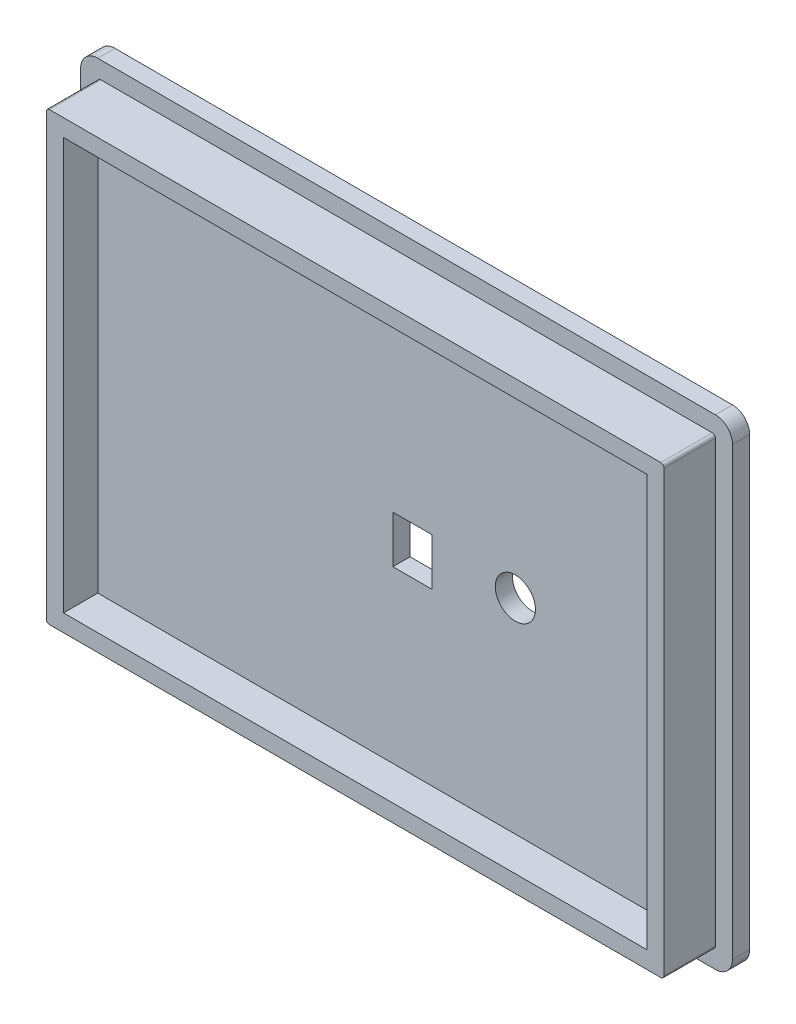
ISO-10303-21;
HEADER;
FILE_DESCRIPTION(('STEP AP214'),'2;1');
FILE_NAME('part.step','',(''),(''),'','','');
FILE_SCHEMA(('AUTOMOTIVE_DESIGN { 1 0 10303 214 1 1 1 1 }'));
ENDSEC;
DATA;
#1=APPLICATION_CONTEXT('core data for automotive mechanical design processes');
#2=APPLICATION_PROTOCOL_DEFINITION('international standard','automotive_design',2000,#1);
#3=PRODUCT_CONTEXT('',#1,'mechanical');
#4=PRODUCT('Part','Part','',(#3));
#5=PRODUCT_RELATED_PRODUCT_CATEGORY('part','',(#4));
#6=PRODUCT_DEFINITION_FORMATION('','',#4);
#7=PRODUCT_DEFINITION_CONTEXT('part definition',#1,'design');
#8=PRODUCT_DEFINITION('design','',#6,#7);
#9=PRODUCT_DEFINITION_SHAPE('','',#8);
#10=(LENGTH_UNIT() NAMED_UNIT(*) SI_UNIT(.MILLI.,.METRE.));
#11=(NAMED_UNIT(*) PLANE_ANGLE_UNIT() SI_UNIT($,.RADIAN.));
#12=(NAMED_UNIT(*) SI_UNIT($,.STERADIAN.) SOLID_ANGLE_UNIT());
#13=UNCERTAINTY_MEASURE_WITH_UNIT(LENGTH_MEASURE(1.E-05),#10,'distance_accuracy_value','');
#14=(GEOMETRIC_REPRESENTATION_CONTEXT(3) GLOBAL_UNCERTAINTY_ASSIGNED_CONTEXT((#13)) GLOBAL_UNIT_ASSIGNED_CONTEXT((#10,
#11,#12)) REPRESENTATION_CONTEXT('',''));
#15=CARTESIAN_POINT('',(0.,0.,0.));
#16=DIRECTION('',(0.,0.,1.));
#17=DIRECTION('',(1.,0.,0.));
#18=AXIS2_PLACEMENT_3D('',#15,#16,#17);
#19=CARTESIAN_POINT('',(-103.247588424437,70.4019292604502,5.));
#20=DIRECTION('',(1.,0.,0.));
#21=DIRECTION('',(0.,1.,0.));
#22=AXIS2_PLACEMENT_3D('',#19,#20,#21);
#23=PLANE('',#22);
#24=DIRECTION('',(0.,-1.,0.));
#25=VECTOR('',#24,1.);
#26=CARTESIAN_POINT('',(-103.247588424437,70.4019292604502,0.));
#27=LINE('',#26,#25);
#28=CARTESIAN_POINT('',(-103.247588424437,65.4019292604502,0.));
#29=VERTEX_POINT('',#28);
#30=CARTESIAN_POINT('',(-103.247588424437,-64.5980707395498,0.));
#31=VERTEX_POINT('',#30);
#32=EDGE_CURVE('E347',#29,#31,#27,.T.);
#33=ORIENTED_EDGE('',*,*,#32,.T.);
#34=DIRECTION('',(0.,0.,-1.));
#35=VECTOR('',#34,1.);
#36=CARTESIAN_POINT('',(-103.247588424437,-64.5980707395498,5.));
#37=LINE('',#36,#35);
#38=CARTESIAN_POINT('',(-103.247588424437,-64.5980707395498,5.));
#39=VERTEX_POINT('',#38);
#40=EDGE_CURVE('E11',#31,#39,#37,.F.);
#41=ORIENTED_EDGE('',*,*,#40,.T.);
#42=DIRECTION('',(0.,-1.,0.));
#43=VECTOR('',#42,1.);
#44=CARTESIAN_POINT('',(-103.247588424437,70.4019292604502,5.));
#45=LINE('',#44,#43);
#46=CARTESIAN_POINT('',(-103.247588424437,65.4019292604502,5.));
#47=VERTEX_POINT('',#46);
#48=EDGE_CURVE('E356',#47,#39,#45,.T.);
#49=ORIENTED_EDGE('',*,*,#48,.F.);
#50=DIRECTION('',(0.,0.,-1.));
#51=VECTOR('',#50,1.);
#52=CARTESIAN_POINT('',(-103.247588424437,65.4019292604502,5.));
#53=LINE('',#52,#51);
#54=EDGE_CURVE('E49',#47,#29,#53,.T.);
#55=ORIENTED_EDGE('',*,*,#54,.T.);
#56=EDGE_LOOP('',(#33,#41,#49,#55));
#57=FACE_BOUND('',#56,.T.);
#58=ADVANCED_FACE('F41',(#57),#23,.F.);
#59=CARTESIAN_POINT('',(-103.247588424437,-69.5980707395498,5.));
#60=DIRECTION('',(0.,1.,0.));
#61=DIRECTION('',(0.,0.,1.));
#62=AXIS2_PLACEMENT_3D('',#59,#60,#61);
#63=PLANE('',#62);
#64=DIRECTION('',(1.,0.,0.));
#65=VECTOR('',#64,1.);
#66=CARTESIAN_POINT('',(-103.247588424437,-69.5980707395498,0.));
#67=LINE('',#66,#65);
#68=CARTESIAN_POINT('',(-98.2475884244373,-69.5980707395498,0.));
#69=VERTEX_POINT('',#68);
#70=CARTESIAN_POINT('',(81.7524115755627,-69.5980707395498,0.));
#71=VERTEX_POINT('',#70);
#72=EDGE_CURVE('E370',#69,#71,#67,.T.);
#73=ORIENTED_EDGE('',*,*,#72,.T.);
#74=DIRECTION('',(0.,0.,-1.));
#75=VECTOR('',#74,1.);
#76=CARTESIAN_POINT('',(81.7524115755627,-69.5980707395498,5.));
#77=LINE('',#76,#75);
#78=CARTESIAN_POINT('',(81.7524115755627,-69.5980707395498,5.));
#79=VERTEX_POINT('',#78);
#80=EDGE_CURVE('E56',#71,#79,#77,.F.);
#81=ORIENTED_EDGE('',*,*,#80,.T.);
#82=DIRECTION('',(1.,0.,0.));
#83=VECTOR('',#82,1.);
#84=CARTESIAN_POINT('',(-103.247588424437,-69.5980707395498,5.));
#85=LINE('',#84,#83);
#86=CARTESIAN_POINT('',(-98.2475884244373,-69.5980707395498,5.));
#87=VERTEX_POINT('',#86);
#88=EDGE_CURVE('E358',#87,#79,#85,.T.);
#89=ORIENTED_EDGE('',*,*,#88,.F.);
#90=DIRECTION('',(0.,0.,-1.));
#91=VECTOR('',#90,1.);
#92=CARTESIAN_POINT('',(-98.2475884244373,-69.5980707395498,5.));
#93=LINE('',#92,#91);
#94=EDGE_CURVE('E474',#87,#69,#93,.T.);
#95=ORIENTED_EDGE('',*,*,#94,.T.);
#96=EDGE_LOOP('',(#73,#81,#89,#95));
#97=FACE_BOUND('',#96,.T.);
#98=ADVANCED_FACE('F492',(#97),#63,.F.);
#99=CARTESIAN_POINT('',(86.7524115755627,70.4019292604502,5.));
#100=DIRECTION('',(-1.,0.,0.));
#101=DIRECTION('',(0.,-1.,0.));
#102=AXIS2_PLACEMENT_3D('',#99,#100,#101);
#103=PLANE('',#102);
#104=DIRECTION('',(0.,1.,0.));
#105=VECTOR('',#104,1.);
#106=CARTESIAN_POINT('',(86.7524115755627,70.4019292604502,0.));
#107=LINE('',#106,#105);
#108=CARTESIAN_POINT('',(86.7524115755627,-64.5980707395498,0.));
#109=VERTEX_POINT('',#108);
#110=CARTESIAN_POINT('',(86.7524115755627,65.4019292604502,0.));
#111=VERTEX_POINT('',#110);
#112=EDGE_CURVE('E372',#109,#111,#107,.T.);
#113=ORIENTED_EDGE('',*,*,#112,.T.);
#114=DIRECTION('',(0.,0.,-1.));
#115=VECTOR('',#114,1.);
#116=CARTESIAN_POINT('',(86.7524115755627,65.4019292604502,5.));
#117=LINE('',#116,#115);
#118=CARTESIAN_POINT('',(86.7524115755627,65.4019292604502,5.));
#119=VERTEX_POINT('',#118);
#120=EDGE_CURVE('E465',#111,#119,#117,.F.);
#121=ORIENTED_EDGE('',*,*,#120,.T.);
#122=DIRECTION('',(0.,1.,0.));
#123=VECTOR('',#122,1.);
#124=CARTESIAN_POINT('',(86.7524115755627,70.4019292604502,5.));
#125=LINE('',#124,#123);
#126=CARTESIAN_POINT('',(86.7524115755627,-64.5980707395498,5.));
#127=VERTEX_POINT('',#126);
#128=EDGE_CURVE('E361',#127,#119,#125,.T.);
#129=ORIENTED_EDGE('',*,*,#128,.F.);
#130=DIRECTION('',(0.,0.,-1.));
#131=VECTOR('',#130,1.);
#132=CARTESIAN_POINT('',(86.7524115755627,-64.5980707395498,5.));
#133=LINE('',#132,#131);
#134=EDGE_CURVE('E462',#127,#109,#133,.T.);
#135=ORIENTED_EDGE('',*,*,#134,.T.);
#136=EDGE_LOOP('',(#113,#121,#129,#135));
#137=FACE_BOUND('',#136,.T.);
#138=ADVANCED_FACE('F501',(#137),#103,.F.);
#139=CARTESIAN_POINT('',(-103.247588424437,70.4019292604502,5.));
#140=DIRECTION('',(0.,-1.,0.));
#141=DIRECTION('',(0.,0.,-1.));
#142=AXIS2_PLACEMENT_3D('',#139,#140,#141);
#143=PLANE('',#142);
#144=DIRECTION('',(-1.,0.,0.));
#145=VECTOR('',#144,1.);
#146=CARTESIAN_POINT('',(-103.247588424437,70.4019292604502,5.));
#147=LINE('',#146,#145);
#148=CARTESIAN_POINT('',(81.7524115755626,70.4019292604502,5.));
#149=VERTEX_POINT('',#148);
#150=CARTESIAN_POINT('',(-98.2475884244373,70.4019292604502,5.));
#151=VERTEX_POINT('',#150);
#152=EDGE_CURVE('E364',#149,#151,#147,.T.);
#153=ORIENTED_EDGE('',*,*,#152,.F.);
#154=DIRECTION('',(0.,0.,-1.));
#155=VECTOR('',#154,1.);
#156=CARTESIAN_POINT('',(81.7524115755626,70.4019292604502,5.));
#157=LINE('',#156,#155);
#158=CARTESIAN_POINT('',(81.7524115755626,70.4019292604502,0.));
#159=VERTEX_POINT('',#158);
#160=EDGE_CURVE('E451',#149,#159,#157,.T.);
#161=ORIENTED_EDGE('',*,*,#160,.T.);
#162=DIRECTION('',(-1.,0.,0.));
#163=VECTOR('',#162,1.);
#164=CARTESIAN_POINT('',(-103.247588424437,70.4019292604502,0.));
#165=LINE('',#164,#163);
#166=CARTESIAN_POINT('',(-98.2475884244373,70.4019292604502,0.));
#167=VERTEX_POINT('',#166);
#168=EDGE_CURVE('E359',#159,#167,#165,.T.);
#169=ORIENTED_EDGE('',*,*,#168,.T.);
#170=DIRECTION('',(0.,0.,-1.));
#171=VECTOR('',#170,1.);
#172=CARTESIAN_POINT('',(-98.2475884244373,70.4019292604502,5.));
#173=LINE('',#172,#171);
#174=EDGE_CURVE('E447',#167,#151,#173,.F.);
#175=ORIENTED_EDGE('',*,*,#174,.T.);
#176=EDGE_LOOP('',(#153,#161,#169,#175));
#177=FACE_BOUND('',#176,.T.);
#178=ADVANCED_FACE('F509',(#177),#143,.F.);
#179=CARTESIAN_POINT('',(0.,0.,5.));
#180=DIRECTION('',(0.,0.,1.));
#181=DIRECTION('',(1.,0.,0.));
#182=AXIS2_PLACEMENT_3D('',#179,#180,#181);
#183=PLANE('',#182);
#184=DIRECTION('',(0.,-1.,0.));
#185=VECTOR('',#184,1.);
#186=CARTESIAN_POINT('',(-98.2475884244373,65.4019292604502,5.));
#187=LINE('',#186,#185);
#188=CARTESIAN_POINT('',(-98.2475884244373,64.5019292604502,5.));
#189=VERTEX_POINT('',#188);
#190=CARTESIAN_POINT('',(-98.2475884244373,-63.6980707395498,5.));
#191=VERTEX_POINT('',#190);
#192=EDGE_CURVE('E301',#189,#191,#187,.T.);
#193=ORIENTED_EDGE('',*,*,#192,.F.);
#194=CARTESIAN_POINT('',(-97.3475884244373,64.5019292604502,5.));
#195=DIRECTION('',(0.,0.,1.));
#196=DIRECTION('',(1.,0.,0.));
#197=AXIS2_PLACEMENT_3D('',#194,#195,#196);
#198=CIRCLE('',#197,0.9);
#199=CARTESIAN_POINT('',(-97.3475884244373,65.4019292604502,5.));
#200=VERTEX_POINT('',#199);
#201=EDGE_CURVE('E435',#189,#200,#198,.F.);
#202=ORIENTED_EDGE('',*,*,#201,.T.);
#203=DIRECTION('',(-1.,0.,0.));
#204=VECTOR('',#203,1.);
#205=CARTESIAN_POINT('',(-98.2475884244373,65.4019292604502,5.));
#206=LINE('',#205,#204);
#207=CARTESIAN_POINT('',(80.8524115755626,65.4019292604502,5.));
#208=VERTEX_POINT('',#207);
#209=EDGE_CURVE('E312',#208,#200,#206,.T.);
#210=ORIENTED_EDGE('',*,*,#209,.F.);
#211=CARTESIAN_POINT('',(80.8524115755627,64.5019292604502,5.));
#212=DIRECTION('',(0.,0.,1.));
#213=DIRECTION('',(1.,0.,0.));
#214=AXIS2_PLACEMENT_3D('',#211,#212,#213);
#215=CIRCLE('',#214,0.9);
#216=CARTESIAN_POINT('',(81.7524115755627,64.5019292604502,5.));
#217=VERTEX_POINT('',#216);
#218=EDGE_CURVE('E431',#208,#217,#215,.F.);
#219=ORIENTED_EDGE('',*,*,#218,.T.);
#220=DIRECTION('',(0.,1.,0.));
#221=VECTOR('',#220,1.);
#222=CARTESIAN_POINT('',(81.7524115755627,65.4019292604502,5.));
#223=LINE('',#222,#221);
#224=CARTESIAN_POINT('',(81.7524115755627,-63.6980707395498,5.));
#225=VERTEX_POINT('',#224);
#226=EDGE_CURVE('E327',#225,#217,#223,.T.);
#227=ORIENTED_EDGE('',*,*,#226,.F.);
#228=CARTESIAN_POINT('',(80.8524115755627,-63.6980707395498,5.));
#229=DIRECTION('',(0.,0.,1.));
#230=DIRECTION('',(1.,0.,0.));
#231=AXIS2_PLACEMENT_3D('',#228,#229,#230);
#232=CIRCLE('',#231,0.9);
#233=CARTESIAN_POINT('',(80.8524115755627,-64.5980707395498,5.));
#234=VERTEX_POINT('',#233);
#235=EDGE_CURVE('E433',#225,#234,#232,.F.);
#236=ORIENTED_EDGE('',*,*,#235,.T.);
#237=DIRECTION('',(1.,0.,0.));
#238=VECTOR('',#237,1.);
#239=CARTESIAN_POINT('',(-98.2475884244373,-64.5980707395498,5.));
#240=LINE('',#239,#238);
#241=CARTESIAN_POINT('',(-97.3475884244373,-64.5980707395498,5.));
#242=VERTEX_POINT('',#241);
#243=EDGE_CURVE('E324',#242,#234,#240,.T.);
#244=ORIENTED_EDGE('',*,*,#243,.F.);
#245=CARTESIAN_POINT('',(-97.3475884244373,-63.6980707395498,5.));
#246=DIRECTION('',(0.,0.,1.));
#247=DIRECTION('',(1.,0.,0.));
#248=AXIS2_PLACEMENT_3D('',#245,#246,#247);
#249=CIRCLE('',#248,0.9);
#250=EDGE_CURVE('E437',#242,#191,#249,.F.);
#251=ORIENTED_EDGE('',*,*,#250,.T.);
#252=EDGE_LOOP('',(#193,#202,#210,#219,#227,#236,#244,#251));
#253=FACE_BOUND('',#252,.T.);
#254=ORIENTED_EDGE('',*,*,#128,.T.);
#255=CARTESIAN_POINT('',(81.7524115755626,65.4019292604502,5.));
#256=DIRECTION('',(0.,0.,1.));
#257=DIRECTION('',(1.,0.,0.));
#258=AXIS2_PLACEMENT_3D('',#255,#256,#257);
#259=CIRCLE('',#258,5.);
#260=EDGE_CURVE('E472',#119,#149,#259,.T.);
#261=ORIENTED_EDGE('',*,*,#260,.T.);
#262=ORIENTED_EDGE('',*,*,#152,.T.);
#263=CARTESIAN_POINT('',(-98.2475884244373,65.4019292604502,5.));
#264=DIRECTION('',(0.,0.,1.));
#265=DIRECTION('',(1.,0.,0.));
#266=AXIS2_PLACEMENT_3D('',#263,#264,#265);
#267=CIRCLE('',#266,5.);
#268=EDGE_CURVE('E467',#151,#47,#267,.T.);
#269=ORIENTED_EDGE('',*,*,#268,.T.);
#270=ORIENTED_EDGE('',*,*,#48,.T.);
#271=CARTESIAN_POINT('',(-98.2475884244373,-64.5980707395498,5.));
#272=DIRECTION('',(0.,0.,1.));
#273=DIRECTION('',(1.,0.,0.));
#274=AXIS2_PLACEMENT_3D('',#271,#272,#273);
#275=CIRCLE('',#274,5.);
#276=EDGE_CURVE('E63',#39,#87,#275,.T.);
#277=ORIENTED_EDGE('',*,*,#276,.T.);
#278=ORIENTED_EDGE('',*,*,#88,.T.);
#279=CARTESIAN_POINT('',(81.7524115755627,-64.5980707395498,5.));
#280=DIRECTION('',(0.,0.,1.));
#281=DIRECTION('',(1.,0.,0.));
#282=AXIS2_PLACEMENT_3D('',#279,#280,#281);
#283=CIRCLE('',#282,5.);
#284=EDGE_CURVE('E470',#79,#127,#283,.T.);
#285=ORIENTED_EDGE('',*,*,#284,.T.);
#286=EDGE_LOOP('',(#254,#261,#262,#269,#270,#277,#278,#285));
#287=FACE_BOUND('',#286,.T.);
#288=ADVANCED_FACE('F494',(#253,#287),#183,.T.);
#289=CARTESIAN_POINT('',(0.,0.,0.));
#290=DIRECTION('',(0.,0.,1.));
#291=DIRECTION('',(1.,0.,0.));
#292=AXIS2_PLACEMENT_3D('',#289,#290,#291);
#293=PLANE('',#292);
#294=DIRECTION('',(-1.,0.,0.));
#295=VECTOR('',#294,1.);
#296=CARTESIAN_POINT('',(0.,-52.4980707395498,0.));
#297=LINE('',#296,#295);
#298=CARTESIAN_POINT('',(-89.1475884244373,-52.4980707395498,0.));
#299=VERTEX_POINT('',#298);
#300=CARTESIAN_POINT('',(72.6524115755627,-52.4980707395498,0.));
#301=VERTEX_POINT('',#300);
#302=EDGE_CURVE('E383',#299,#301,#297,.F.);
#303=ORIENTED_EDGE('',*,*,#302,.T.);
#304=DIRECTION('',(0.,-1.,0.));
#305=VECTOR('',#304,1.);
#306=CARTESIAN_POINT('',(72.6524115755627,0.,0.));
#307=LINE('',#306,#305);
#308=CARTESIAN_POINT('',(72.6524115755627,53.3019292604502,0.));
#309=VERTEX_POINT('',#308);
#310=EDGE_CURVE('E385',#301,#309,#307,.F.);
#311=ORIENTED_EDGE('',*,*,#310,.T.);
#312=DIRECTION('',(1.,0.,0.));
#313=VECTOR('',#312,1.);
#314=CARTESIAN_POINT('',(0.,53.3019292604502,0.));
#315=LINE('',#314,#313);
#316=CARTESIAN_POINT('',(-89.1475884244374,53.3019292604502,0.));
#317=VERTEX_POINT('',#316);
#318=EDGE_CURVE('E379',#309,#317,#315,.F.);
#319=ORIENTED_EDGE('',*,*,#318,.T.);
#320=DIRECTION('',(0.,1.,0.));
#321=VECTOR('',#320,1.);
#322=CARTESIAN_POINT('',(-89.1475884244373,0.,0.));
#323=LINE('',#322,#321);
#324=EDGE_CURVE('E381',#317,#299,#323,.F.);
#325=ORIENTED_EDGE('',*,*,#324,.T.);
#326=EDGE_LOOP('',(#303,#311,#319,#325));
#327=FACE_BOUND('',#326,.T.);
#328=ORIENTED_EDGE('',*,*,#168,.F.);
#329=CARTESIAN_POINT('',(81.7524115755626,65.4019292604502,0.));
#330=DIRECTION('',(0.,0.,1.));
#331=DIRECTION('',(1.,0.,0.));
#332=AXIS2_PLACEMENT_3D('',#329,#330,#331);
#333=CIRCLE('',#332,5.);
#334=EDGE_CURVE('E460',#159,#111,#333,.F.);
#335=ORIENTED_EDGE('',*,*,#334,.T.);
#336=ORIENTED_EDGE('',*,*,#112,.F.);
#337=CARTESIAN_POINT('',(81.7524115755627,-64.5980707395498,0.));
#338=DIRECTION('',(0.,0.,1.));
#339=DIRECTION('',(1.,0.,0.));
#340=AXIS2_PLACEMENT_3D('',#337,#338,#339);
#341=CIRCLE('',#340,5.);
#342=EDGE_CURVE('E458',#109,#71,#341,.F.);
#343=ORIENTED_EDGE('',*,*,#342,.T.);
#344=ORIENTED_EDGE('',*,*,#72,.F.);
#345=CARTESIAN_POINT('',(-98.2475884244373,-64.5980707395498,0.));
#346=DIRECTION('',(0.,0.,1.));
#347=DIRECTION('',(1.,0.,0.));
#348=AXIS2_PLACEMENT_3D('',#345,#346,#347);
#349=CIRCLE('',#348,5.);
#350=EDGE_CURVE('E456',#69,#31,#349,.F.);
#351=ORIENTED_EDGE('',*,*,#350,.T.);
#352=ORIENTED_EDGE('',*,*,#32,.F.);
#353=CARTESIAN_POINT('',(-98.2475884244373,65.4019292604502,0.));
#354=DIRECTION('',(0.,0.,1.));
#355=DIRECTION('',(1.,0.,0.));
#356=AXIS2_PLACEMENT_3D('',#353,#354,#355);
#357=CIRCLE('',#356,5.);
#358=EDGE_CURVE('E454',#29,#167,#357,.F.);
#359=ORIENTED_EDGE('',*,*,#358,.T.);
#360=EDGE_LOOP('',(#328,#335,#336,#343,#344,#351,#352,#359));
#361=FACE_BOUND('',#360,.T.);
#362=ADVANCED_FACE('F487',(#327,#361),#293,.F.);
#363=CARTESIAN_POINT('',(71.7524115755627,52.4019292604502,5.));
#364=DIRECTION('',(1.,0.,0.));
#365=DIRECTION('',(0.,1.,0.));
#366=AXIS2_PLACEMENT_3D('',#363,#364,#365);
#367=PLANE('',#366);
#368=DIRECTION('',(0.,0.,-1.));
#369=VECTOR('',#368,1.);
#370=CARTESIAN_POINT('',(71.7524115755627,52.4019292604502,5.));
#371=LINE('',#370,#369);
#372=CARTESIAN_POINT('',(71.7524115755627,52.4019292604502,5.));
#373=VERTEX_POINT('',#372);
#374=CARTESIAN_POINT('',(71.7524115755627,52.4019292604502,0.9));
#375=VERTEX_POINT('',#374);
#376=EDGE_CURVE('E344',#373,#375,#371,.T.);
#377=ORIENTED_EDGE('',*,*,#376,.T.);
#378=DIRECTION('',(0.,-1.,0.));
#379=VECTOR('',#378,1.);
#380=CARTESIAN_POINT('',(71.7524115755627,52.4019292604502,0.9));
#381=LINE('',#380,#379);
#382=CARTESIAN_POINT('',(71.7524115755627,-51.5980707395498,0.9));
#383=VERTEX_POINT('',#382);
#384=EDGE_CURVE('E367',#375,#383,#381,.T.);
#385=ORIENTED_EDGE('',*,*,#384,.T.);
#386=DIRECTION('',(0.,0.,-1.));
#387=VECTOR('',#386,1.);
#388=CARTESIAN_POINT('',(71.7524115755627,-51.5980707395498,5.));
#389=LINE('',#388,#387);
#390=CARTESIAN_POINT('',(71.7524115755627,-51.5980707395498,5.));
#391=VERTEX_POINT('',#390);
#392=EDGE_CURVE('E343',#391,#383,#389,.T.);
#393=ORIENTED_EDGE('',*,*,#392,.F.);
#394=DIRECTION('',(0.,-1.,0.));
#395=VECTOR('',#394,1.);
#396=CARTESIAN_POINT('',(71.7524115755627,52.4019292604502,5.));
#397=LINE('',#396,#395);
#398=EDGE_CURVE('E321',#373,#391,#397,.T.);
#399=ORIENTED_EDGE('',*,*,#398,.F.);
#400=EDGE_LOOP('',(#377,#385,#393,#399));
#401=FACE_BOUND('',#400,.T.);
#402=ADVANCED_FACE('F816',(#401),#367,.F.);
#403=CARTESIAN_POINT('',(71.7524115755627,52.4019292604502,5.));
#404=DIRECTION('',(0.,1.,0.));
#405=DIRECTION('',(0.,0.,1.));
#406=AXIS2_PLACEMENT_3D('',#403,#404,#405);
#407=PLANE('',#406);
#408=DIRECTION('',(0.,0.,-1.));
#409=VECTOR('',#408,1.);
#410=CARTESIAN_POINT('',(-88.2475884244374,52.4019292604502,5.));
#411=LINE('',#410,#409);
#412=CARTESIAN_POINT('',(-88.2475884244374,52.4019292604502,5.));
#413=VERTEX_POINT('',#412);
#414=CARTESIAN_POINT('',(-88.2475884244374,52.4019292604502,0.9));
#415=VERTEX_POINT('',#414);
#416=EDGE_CURVE('E348',#413,#415,#411,.T.);
#417=ORIENTED_EDGE('',*,*,#416,.T.);
#418=DIRECTION('',(1.,0.,0.));
#419=VECTOR('',#418,1.);
#420=CARTESIAN_POINT('',(71.7524115755627,52.4019292604502,0.9));
#421=LINE('',#420,#419);
#422=EDGE_CURVE('E392',#415,#375,#421,.T.);
#423=ORIENTED_EDGE('',*,*,#422,.T.);
#424=ORIENTED_EDGE('',*,*,#376,.F.);
#425=DIRECTION('',(1.,0.,0.));
#426=VECTOR('',#425,1.);
#427=CARTESIAN_POINT('',(71.7524115755627,52.4019292604502,5.));
#428=LINE('',#427,#426);
#429=EDGE_CURVE('E340',#413,#373,#428,.T.);
#430=ORIENTED_EDGE('',*,*,#429,.F.);
#431=EDGE_LOOP('',(#417,#423,#424,#430));
#432=FACE_BOUND('',#431,.T.);
#433=ADVANCED_FACE('F806',(#432),#407,.F.);
#434=CARTESIAN_POINT('',(-88.2475884244374,52.4019292604502,5.));
#435=DIRECTION('',(-1.,0.,0.));
#436=DIRECTION('',(0.,-1.,0.));
#437=AXIS2_PLACEMENT_3D('',#434,#435,#436);
#438=PLANE('',#437);
#439=DIRECTION('',(0.,0.,-1.));
#440=VECTOR('',#439,1.);
#441=CARTESIAN_POINT('',(-88.2475884244373,-51.5980707395498,5.));
#442=LINE('',#441,#440);
#443=CARTESIAN_POINT('',(-88.2475884244373,-51.5980707395498,5.));
#444=VERTEX_POINT('',#443);
#445=CARTESIAN_POINT('',(-88.2475884244373,-51.5980707395498,0.9));
#446=VERTEX_POINT('',#445);
#447=EDGE_CURVE('E351',#444,#446,#442,.T.);
#448=ORIENTED_EDGE('',*,*,#447,.T.);
#449=DIRECTION('',(0.,1.,0.));
#450=VECTOR('',#449,1.);
#451=CARTESIAN_POINT('',(-88.2475884244374,52.4019292604502,0.9));
#452=LINE('',#451,#450);
#453=EDGE_CURVE('E390',#446,#415,#452,.T.);
#454=ORIENTED_EDGE('',*,*,#453,.T.);
#455=ORIENTED_EDGE('',*,*,#416,.F.);
#456=DIRECTION('',(0.,1.,0.));
#457=VECTOR('',#456,1.);
#458=CARTESIAN_POINT('',(-88.2475884244374,52.4019292604502,5.));
#459=LINE('',#458,#457);
#460=EDGE_CURVE('E337',#444,#413,#459,.T.);
#461=ORIENTED_EDGE('',*,*,#460,.F.);
#462=EDGE_LOOP('',(#448,#454,#455,#461));
#463=FACE_BOUND('',#462,.T.);
#464=ADVANCED_FACE('F796',(#463),#438,.F.);
#465=CARTESIAN_POINT('',(71.7524115755627,-51.5980707395498,5.));
#466=DIRECTION('',(0.,-1.,0.));
#467=DIRECTION('',(0.,0.,-1.));
#468=AXIS2_PLACEMENT_3D('',#465,#466,#467);
#469=PLANE('',#468);
#470=ORIENTED_EDGE('',*,*,#392,.T.);
#471=DIRECTION('',(-1.,0.,0.));
#472=VECTOR('',#471,1.);
#473=CARTESIAN_POINT('',(71.7524115755627,-51.5980707395498,0.9));
#474=LINE('',#473,#472);
#475=EDGE_CURVE('E388',#383,#446,#474,.T.);
#476=ORIENTED_EDGE('',*,*,#475,.T.);
#477=ORIENTED_EDGE('',*,*,#447,.F.);
#478=DIRECTION('',(-1.,0.,0.));
#479=VECTOR('',#478,1.);
#480=CARTESIAN_POINT('',(71.7524115755627,-51.5980707395498,5.));
#481=LINE('',#480,#479);
#482=EDGE_CURVE('E334',#391,#444,#481,.T.);
#483=ORIENTED_EDGE('',*,*,#482,.F.);
#484=EDGE_LOOP('',(#470,#476,#477,#483));
#485=FACE_BOUND('',#484,.T.);
#486=ADVANCED_FACE('F786',(#485),#469,.F.);
#487=CARTESIAN_POINT('',(0.,0.,20.));
#488=DIRECTION('',(0.,0.,1.));
#489=DIRECTION('',(1.,0.,0.));
#490=AXIS2_PLACEMENT_3D('',#487,#488,#489);
#491=PLANE('',#490);
#492=DIRECTION('',(0.,-1.,0.));
#493=VECTOR('',#492,1.);
#494=CARTESIAN_POINT('',(-93.2475884244373,60.4019292604502,20.));
#495=LINE('',#494,#493);
#496=CARTESIAN_POINT('',(-93.2475884244373,60.4019292604502,20.));
#497=VERTEX_POINT('',#496);
#498=CARTESIAN_POINT('',(-93.2475884244373,-59.5980707395498,20.));
#499=VERTEX_POINT('',#498);
#500=EDGE_CURVE('E288',#497,#499,#495,.T.);
#501=ORIENTED_EDGE('',*,*,#500,.F.);
#502=DIRECTION('',(-1.,0.,0.));
#503=VECTOR('',#502,1.);
#504=CARTESIAN_POINT('',(-93.2475884244373,60.4019292604502,20.));
#505=LINE('',#504,#503);
#506=CARTESIAN_POINT('',(76.7524115755627,60.4019292604502,20.));
#507=VERTEX_POINT('',#506);
#508=EDGE_CURVE('E278',#507,#497,#505,.T.);
#509=ORIENTED_EDGE('',*,*,#508,.F.);
#510=DIRECTION('',(0.,1.,0.));
#511=VECTOR('',#510,1.);
#512=CARTESIAN_POINT('',(76.7524115755627,60.4019292604502,20.));
#513=LINE('',#512,#511);
#514=CARTESIAN_POINT('',(76.7524115755627,-59.5980707395498,20.));
#515=VERTEX_POINT('',#514);
#516=EDGE_CURVE('E294',#515,#507,#513,.T.);
#517=ORIENTED_EDGE('',*,*,#516,.F.);
#518=DIRECTION('',(1.,0.,0.));
#519=VECTOR('',#518,1.);
#520=CARTESIAN_POINT('',(-93.2475884244373,-59.5980707395498,20.));
#521=LINE('',#520,#519);
#522=EDGE_CURVE('E290',#499,#515,#521,.T.);
#523=ORIENTED_EDGE('',*,*,#522,.F.);
#524=EDGE_LOOP('',(#501,#509,#517,#523));
#525=FACE_BOUND('',#524,.T.);
#526=DIRECTION('',(0.,1.,0.));
#527=VECTOR('',#526,1.);
#528=CARTESIAN_POINT('',(81.7524115755627,65.4019292604502,20.));
#529=LINE('',#528,#527);
#530=CARTESIAN_POINT('',(81.7524115755627,-63.6980707395498,20.));
#531=VERTEX_POINT('',#530);
#532=CARTESIAN_POINT('',(81.7524115755627,64.5019292604502,20.));
#533=VERTEX_POINT('',#532);
#534=EDGE_CURVE('E315',#531,#533,#529,.T.);
#535=ORIENTED_EDGE('',*,*,#534,.T.);
#536=CARTESIAN_POINT('',(80.8524115755627,64.5019292604502,20.));
#537=DIRECTION('',(0.,0.,1.));
#538=DIRECTION('',(1.,0.,0.));
#539=AXIS2_PLACEMENT_3D('',#536,#537,#538);
#540=CIRCLE('',#539,0.9);
#541=CARTESIAN_POINT('',(80.8524115755626,65.4019292604502,20.));
#542=VERTEX_POINT('',#541);
#543=EDGE_CURVE('E419',#533,#542,#540,.T.);
#544=ORIENTED_EDGE('',*,*,#543,.T.);
#545=DIRECTION('',(-1.,0.,0.));
#546=VECTOR('',#545,1.);
#547=CARTESIAN_POINT('',(-98.2475884244373,65.4019292604502,20.));
#548=LINE('',#547,#546);
#549=CARTESIAN_POINT('',(-97.3475884244373,65.4019292604502,20.));
#550=VERTEX_POINT('',#549);
#551=EDGE_CURVE('E318',#542,#550,#548,.T.);
#552=ORIENTED_EDGE('',*,*,#551,.T.);
#553=CARTESIAN_POINT('',(-97.3475884244373,64.5019292604502,20.));
#554=DIRECTION('',(0.,0.,1.));
#555=DIRECTION('',(1.,0.,0.));
#556=AXIS2_PLACEMENT_3D('',#553,#554,#555);
#557=CIRCLE('',#556,0.9);
#558=CARTESIAN_POINT('',(-98.2475884244373,64.5019292604502,20.));
#559=VERTEX_POINT('',#558);
#560=EDGE_CURVE('E415',#550,#559,#557,.T.);
#561=ORIENTED_EDGE('',*,*,#560,.T.);
#562=DIRECTION('',(0.,-1.,0.));
#563=VECTOR('',#562,1.);
#564=CARTESIAN_POINT('',(-98.2475884244373,65.4019292604502,20.));
#565=LINE('',#564,#563);
#566=CARTESIAN_POINT('',(-98.2475884244373,-63.6980707395498,20.));
#567=VERTEX_POINT('',#566);
#568=EDGE_CURVE('E308',#559,#567,#565,.T.);
#569=ORIENTED_EDGE('',*,*,#568,.T.);
#570=CARTESIAN_POINT('',(-97.3475884244373,-63.6980707395498,20.));
#571=DIRECTION('',(0.,0.,1.));
#572=DIRECTION('',(1.,0.,0.));
#573=AXIS2_PLACEMENT_3D('',#570,#571,#572);
#574=CIRCLE('',#573,0.9);
#575=CARTESIAN_POINT('',(-97.3475884244373,-64.5980707395498,20.));
#576=VERTEX_POINT('',#575);
#577=EDGE_CURVE('E413',#567,#576,#574,.T.);
#578=ORIENTED_EDGE('',*,*,#577,.T.);
#579=DIRECTION('',(1.,0.,0.));
#580=VECTOR('',#579,1.);
#581=CARTESIAN_POINT('',(-98.2475884244373,-64.5980707395498,20.));
#582=LINE('',#581,#580);
#583=CARTESIAN_POINT('',(80.8524115755627,-64.5980707395498,20.));
#584=VERTEX_POINT('',#583);
#585=EDGE_CURVE('E311',#576,#584,#582,.T.);
#586=ORIENTED_EDGE('',*,*,#585,.T.);
#587=CARTESIAN_POINT('',(80.8524115755627,-63.6980707395498,20.));
#588=DIRECTION('',(0.,0.,1.));
#589=DIRECTION('',(1.,0.,0.));
#590=AXIS2_PLACEMENT_3D('',#587,#588,#589);
#591=CIRCLE('',#590,0.9);
#592=EDGE_CURVE('E417',#584,#531,#591,.T.);
#593=ORIENTED_EDGE('',*,*,#592,.T.);
#594=EDGE_LOOP('',(#535,#544,#552,#561,#569,#578,#586,#593));
#595=FACE_BOUND('',#594,.T.);
#596=ADVANCED_FACE('F776',(#525,#595),#491,.T.);
#597=CARTESIAN_POINT('',(-98.2475884244373,65.4019292604502,20.));
#598=DIRECTION('',(0.,-1.,0.));
#599=DIRECTION('',(0.,0.,-1.));
#600=AXIS2_PLACEMENT_3D('',#597,#598,#599);
#601=PLANE('',#600);
#602=ORIENTED_EDGE('',*,*,#551,.F.);
#603=DIRECTION('',(0.,0.,-1.));
#604=VECTOR('',#603,1.);
#605=CARTESIAN_POINT('',(80.8524115755627,65.4019292604502,20.));
#606=LINE('',#605,#604);
#607=EDGE_CURVE('E405',#542,#208,#606,.T.);
#608=ORIENTED_EDGE('',*,*,#607,.T.);
#609=ORIENTED_EDGE('',*,*,#209,.T.);
#610=DIRECTION('',(0.,0.,-1.));
#611=VECTOR('',#610,1.);
#612=CARTESIAN_POINT('',(-97.3475884244373,65.4019292604502,20.));
#613=LINE('',#612,#611);
#614=EDGE_CURVE('E394',#200,#550,#613,.F.);
#615=ORIENTED_EDGE('',*,*,#614,.T.);
#616=EDGE_LOOP('',(#602,#608,#609,#615));
#617=FACE_BOUND('',#616,.T.);
#618=ADVANCED_FACE('F766',(#617),#601,.F.);
#619=CARTESIAN_POINT('',(81.7524115755627,65.4019292604502,20.));
#620=DIRECTION('',(-1.,0.,0.));
#621=DIRECTION('',(0.,-1.,0.));
#622=AXIS2_PLACEMENT_3D('',#619,#620,#621);
#623=PLANE('',#622);
#624=ORIENTED_EDGE('',*,*,#226,.T.);
#625=DIRECTION('',(0.,0.,-1.));
#626=VECTOR('',#625,1.);
#627=CARTESIAN_POINT('',(81.7524115755627,64.5019292604502,20.));
#628=LINE('',#627,#626);
#629=EDGE_CURVE('E411',#217,#533,#628,.F.);
#630=ORIENTED_EDGE('',*,*,#629,.T.);
#631=ORIENTED_EDGE('',*,*,#534,.F.);
#632=DIRECTION('',(0.,0.,-1.));
#633=VECTOR('',#632,1.);
#634=CARTESIAN_POINT('',(81.7524115755627,-63.6980707395498,20.));
#635=LINE('',#634,#633);
#636=EDGE_CURVE('E408',#531,#225,#635,.T.);
#637=ORIENTED_EDGE('',*,*,#636,.T.);
#638=EDGE_LOOP('',(#624,#630,#631,#637));
#639=FACE_BOUND('',#638,.T.);
#640=ADVANCED_FACE('F756',(#639),#623,.F.);
#641=CARTESIAN_POINT('',(-98.2475884244373,-64.5980707395498,20.));
#642=DIRECTION('',(0.,1.,0.));
#643=DIRECTION('',(0.,0.,1.));
#644=AXIS2_PLACEMENT_3D('',#641,#642,#643);
#645=PLANE('',#644);
#646=ORIENTED_EDGE('',*,*,#243,.T.);
#647=DIRECTION('',(0.,0.,-1.));
#648=VECTOR('',#647,1.);
#649=CARTESIAN_POINT('',(80.8524115755627,-64.5980707395498,20.));
#650=LINE('',#649,#648);
#651=EDGE_CURVE('E424',#234,#584,#650,.F.);
#652=ORIENTED_EDGE('',*,*,#651,.T.);
#653=ORIENTED_EDGE('',*,*,#585,.F.);
#654=DIRECTION('',(0.,0.,-1.));
#655=VECTOR('',#654,1.);
#656=CARTESIAN_POINT('',(-97.3475884244373,-64.5980707395498,20.));
#657=LINE('',#656,#655);
#658=EDGE_CURVE('E421',#576,#242,#657,.T.);
#659=ORIENTED_EDGE('',*,*,#658,.T.);
#660=EDGE_LOOP('',(#646,#652,#653,#659));
#661=FACE_BOUND('',#660,.T.);
#662=ADVANCED_FACE('F746',(#661),#645,.F.);
#663=CARTESIAN_POINT('',(-98.2475884244373,65.4019292604502,20.));
#664=DIRECTION('',(1.,0.,0.));
#665=DIRECTION('',(0.,1.,0.));
#666=AXIS2_PLACEMENT_3D('',#663,#664,#665);
#667=PLANE('',#666);
#668=ORIENTED_EDGE('',*,*,#568,.F.);
#669=DIRECTION('',(0.,0.,-1.));
#670=VECTOR('',#669,1.);
#671=CARTESIAN_POINT('',(-98.2475884244373,64.5019292604502,20.));
#672=LINE('',#671,#670);
#673=EDGE_CURVE('E428',#559,#189,#672,.T.);
#674=ORIENTED_EDGE('',*,*,#673,.T.);
#675=ORIENTED_EDGE('',*,*,#192,.T.);
#676=DIRECTION('',(0.,0.,-1.));
#677=VECTOR('',#676,1.);
#678=CARTESIAN_POINT('',(-98.2475884244373,-63.6980707395498,20.));
#679=LINE('',#678,#677);
#680=EDGE_CURVE('E426',#191,#567,#679,.F.);
#681=ORIENTED_EDGE('',*,*,#680,.T.);
#682=EDGE_LOOP('',(#668,#674,#675,#681));
#683=FACE_BOUND('',#682,.T.);
#684=ADVANCED_FACE('F736',(#683),#667,.F.);
#685=CARTESIAN_POINT('',(0.,0.,5.));
#686=DIRECTION('',(0.,0.,1.));
#687=DIRECTION('',(1.,0.,0.));
#688=AXIS2_PLACEMENT_3D('',#685,#686,#687);
#689=PLANE('',#688);
#690=CARTESIAN_POINT('',(28.4563319259241,0.,5.));
#691=DIRECTION('',(0.,0.,-1.));
#692=DIRECTION('',(-1.,0.,0.));
#693=AXIS2_PLACEMENT_3D('',#690,#691,#692);
#694=CIRCLE('',#693,5.85098845756077);
#695=CARTESIAN_POINT('',(22.6053434683633,0.,5.));
#696=VERTEX_POINT('',#695);
#697=EDGE_CURVE('E266',#696,#696,#694,.T.);
#698=ORIENTED_EDGE('',*,*,#697,.F.);
#699=EDGE_LOOP('',(#698));
#700=FACE_BOUND('',#699,.T.);
#701=DIRECTION('',(-1.,0.,0.));
#702=VECTOR('',#701,1.);
#703=CARTESIAN_POINT('',(4.20986660594652,-9.93229310994485,5.));
#704=LINE('',#703,#702);
#705=CARTESIAN_POINT('',(4.20986660594652,-9.93229310994485,5.));
#706=VERTEX_POINT('',#705);
#707=CARTESIAN_POINT('',(-7.2344650250829,-9.93229310994485,5.));
#708=VERTEX_POINT('',#707);
#709=EDGE_CURVE('E265',#706,#708,#704,.T.);
#710=ORIENTED_EDGE('',*,*,#709,.F.);
#711=DIRECTION('',(0.,-1.,0.));
#712=VECTOR('',#711,1.);
#713=CARTESIAN_POINT('',(4.20986660594652,3.83969919180242,5.));
#714=LINE('',#713,#712);
#715=CARTESIAN_POINT('',(4.20986660594652,3.83969919180242,5.));
#716=VERTEX_POINT('',#715);
#717=EDGE_CURVE('E243',#716,#706,#714,.T.);
#718=ORIENTED_EDGE('',*,*,#717,.F.);
#719=DIRECTION('',(1.,0.,0.));
#720=VECTOR('',#719,1.);
#721=CARTESIAN_POINT('',(4.20986660594652,3.83969919180242,5.));
#722=LINE('',#721,#720);
#723=CARTESIAN_POINT('',(-7.2344650250829,3.83969919180242,5.));
#724=VERTEX_POINT('',#723);
#725=EDGE_CURVE('E252',#724,#716,#722,.T.);
#726=ORIENTED_EDGE('',*,*,#725,.F.);
#727=DIRECTION('',(0.,1.,0.));
#728=VECTOR('',#727,1.);
#729=CARTESIAN_POINT('',(-7.2344650250829,3.83969919180242,5.));
#730=LINE('',#729,#728);
#731=EDGE_CURVE('E258',#708,#724,#730,.T.);
#732=ORIENTED_EDGE('',*,*,#731,.F.);
#733=EDGE_LOOP('',(#710,#718,#726,#732));
#734=FACE_BOUND('',#733,.T.);
#735=ORIENTED_EDGE('',*,*,#429,.T.);
#736=ORIENTED_EDGE('',*,*,#398,.T.);
#737=ORIENTED_EDGE('',*,*,#482,.T.);
#738=ORIENTED_EDGE('',*,*,#460,.T.);
#739=EDGE_LOOP('',(#735,#736,#737,#738));
#740=FACE_BOUND('',#739,.T.);
#741=ADVANCED_FACE('F262',(#700,#734,#740),#689,.F.);
#742=CARTESIAN_POINT('',(-93.2475884244373,60.4019292604502,10.));
#743=DIRECTION('',(-1.,0.,0.));
#744=DIRECTION('',(0.,-1.,0.));
#745=AXIS2_PLACEMENT_3D('',#742,#743,#744);
#746=PLANE('',#745);
#747=ORIENTED_EDGE('',*,*,#500,.T.);
#748=DIRECTION('',(0.,0.,1.));
#749=VECTOR('',#748,1.);
#750=CARTESIAN_POINT('',(-93.2475884244373,-59.5980707395498,10.));
#751=LINE('',#750,#749);
#752=CARTESIAN_POINT('',(-93.2475884244373,-59.5980707395498,10.));
#753=VERTEX_POINT('',#752);
#754=EDGE_CURVE('E287',#753,#499,#751,.T.);
#755=ORIENTED_EDGE('',*,*,#754,.F.);
#756=DIRECTION('',(0.,-1.,0.));
#757=VECTOR('',#756,1.);
#758=CARTESIAN_POINT('',(-93.2475884244373,60.4019292604502,10.));
#759=LINE('',#758,#757);
#760=CARTESIAN_POINT('',(-93.2475884244373,60.4019292604502,10.));
#761=VERTEX_POINT('',#760);
#762=EDGE_CURVE('E274',#761,#753,#759,.T.);
#763=ORIENTED_EDGE('',*,*,#762,.F.);
#764=DIRECTION('',(0.,0.,1.));
#765=VECTOR('',#764,1.);
#766=CARTESIAN_POINT('',(-93.2475884244373,60.4019292604502,10.));
#767=LINE('',#766,#765);
#768=EDGE_CURVE('E299',#761,#497,#767,.T.);
#769=ORIENTED_EDGE('',*,*,#768,.T.);
#770=EDGE_LOOP('',(#747,#755,#763,#769));
#771=FACE_BOUND('',#770,.T.);
#772=ADVANCED_FACE('F717',(#771),#746,.F.);
#773=CARTESIAN_POINT('',(-93.2475884244373,60.4019292604502,10.));
#774=DIRECTION('',(0.,1.,0.));
#775=DIRECTION('',(0.,0.,1.));
#776=AXIS2_PLACEMENT_3D('',#773,#774,#775);
#777=PLANE('',#776);
#778=ORIENTED_EDGE('',*,*,#508,.T.);
#779=ORIENTED_EDGE('',*,*,#768,.F.);
#780=DIRECTION('',(-1.,0.,0.));
#781=VECTOR('',#780,1.);
#782=CARTESIAN_POINT('',(-93.2475884244373,60.4019292604502,10.));
#783=LINE('',#782,#781);
#784=CARTESIAN_POINT('',(76.7524115755627,60.4019292604502,10.));
#785=VERTEX_POINT('',#784);
#786=EDGE_CURVE('E284',#785,#761,#783,.T.);
#787=ORIENTED_EDGE('',*,*,#786,.F.);
#788=DIRECTION('',(0.,0.,1.));
#789=VECTOR('',#788,1.);
#790=CARTESIAN_POINT('',(76.7524115755627,60.4019292604502,10.));
#791=LINE('',#790,#789);
#792=EDGE_CURVE('E302',#785,#507,#791,.T.);
#793=ORIENTED_EDGE('',*,*,#792,.T.);
#794=EDGE_LOOP('',(#778,#779,#787,#793));
#795=FACE_BOUND('',#794,.T.);
#796=ADVANCED_FACE('F707',(#795),#777,.F.);
#797=CARTESIAN_POINT('',(76.7524115755627,60.4019292604502,10.));
#798=DIRECTION('',(1.,0.,0.));
#799=DIRECTION('',(0.,1.,0.));
#800=AXIS2_PLACEMENT_3D('',#797,#798,#799);
#801=PLANE('',#800);
#802=ORIENTED_EDGE('',*,*,#516,.T.);
#803=ORIENTED_EDGE('',*,*,#792,.F.);
#804=DIRECTION('',(0.,1.,0.));
#805=VECTOR('',#804,1.);
#806=CARTESIAN_POINT('',(76.7524115755627,60.4019292604502,10.));
#807=LINE('',#806,#805);
#808=CARTESIAN_POINT('',(76.7524115755627,-59.5980707395498,10.));
#809=VERTEX_POINT('',#808);
#810=EDGE_CURVE('E281',#809,#785,#807,.T.);
#811=ORIENTED_EDGE('',*,*,#810,.F.);
#812=DIRECTION('',(0.,0.,1.));
#813=VECTOR('',#812,1.);
#814=CARTESIAN_POINT('',(76.7524115755627,-59.5980707395498,10.));
#815=LINE('',#814,#813);
#816=EDGE_CURVE('E304',#809,#515,#815,.T.);
#817=ORIENTED_EDGE('',*,*,#816,.T.);
#818=EDGE_LOOP('',(#802,#803,#811,#817));
#819=FACE_BOUND('',#818,.T.);
#820=ADVANCED_FACE('F697',(#819),#801,.F.);
#821=CARTESIAN_POINT('',(-93.2475884244373,-59.5980707395498,10.));
#822=DIRECTION('',(0.,-1.,0.));
#823=DIRECTION('',(0.,0.,-1.));
#824=AXIS2_PLACEMENT_3D('',#821,#822,#823);
#825=PLANE('',#824);
#826=ORIENTED_EDGE('',*,*,#522,.T.);
#827=ORIENTED_EDGE('',*,*,#816,.F.);
#828=DIRECTION('',(1.,0.,0.));
#829=VECTOR('',#828,1.);
#830=CARTESIAN_POINT('',(-93.2475884244373,-59.5980707395498,10.));
#831=LINE('',#830,#829);
#832=EDGE_CURVE('E277',#753,#809,#831,.T.);
#833=ORIENTED_EDGE('',*,*,#832,.F.);
#834=ORIENTED_EDGE('',*,*,#754,.T.);
#835=EDGE_LOOP('',(#826,#827,#833,#834));
#836=FACE_BOUND('',#835,.T.);
#837=ADVANCED_FACE('F687',(#836),#825,.F.);
#838=CARTESIAN_POINT('',(0.,0.,10.));
#839=DIRECTION('',(0.,0.,1.));
#840=DIRECTION('',(1.,0.,0.));
#841=AXIS2_PLACEMENT_3D('',#838,#839,#840);
#842=PLANE('',#841);
#843=CARTESIAN_POINT('',(28.4563319259241,0.,10.));
#844=DIRECTION('',(0.,0.,1.));
#845=DIRECTION('',(1.,0.,0.));
#846=AXIS2_PLACEMENT_3D('',#843,#844,#845);
#847=CIRCLE('',#846,5.85098845756077);
#848=CARTESIAN_POINT('',(34.3073203834849,0.,10.));
#849=VERTEX_POINT('',#848);
#850=EDGE_CURVE('E269',#849,#849,#847,.T.);
#851=ORIENTED_EDGE('',*,*,#850,.F.);
#852=EDGE_LOOP('',(#851));
#853=FACE_BOUND('',#852,.T.);
#854=DIRECTION('',(0.,1.,0.));
#855=VECTOR('',#854,1.);
#856=CARTESIAN_POINT('',(4.20986660594652,0.,10.));
#857=LINE('',#856,#855);
#858=CARTESIAN_POINT('',(4.20986660594652,-9.93229310994485,10.));
#859=VERTEX_POINT('',#858);
#860=CARTESIAN_POINT('',(4.20986660594652,3.83969919180242,10.));
#861=VERTEX_POINT('',#860);
#862=EDGE_CURVE('E246',#859,#861,#857,.T.);
#863=ORIENTED_EDGE('',*,*,#862,.F.);
#864=DIRECTION('',(1.,0.,0.));
#865=VECTOR('',#864,1.);
#866=CARTESIAN_POINT('',(0.,-9.93229310994485,10.));
#867=LINE('',#866,#865);
#868=CARTESIAN_POINT('',(-7.2344650250829,-9.93229310994485,10.));
#869=VERTEX_POINT('',#868);
#870=EDGE_CURVE('E439',#869,#859,#867,.T.);
#871=ORIENTED_EDGE('',*,*,#870,.F.);
#872=DIRECTION('',(0.,-1.,0.));
#873=VECTOR('',#872,1.);
#874=CARTESIAN_POINT('',(-7.2344650250829,0.,10.));
#875=LINE('',#874,#873);
#876=CARTESIAN_POINT('',(-7.2344650250829,3.83969919180242,10.));
#877=VERTEX_POINT('',#876);
#878=EDGE_CURVE('E441',#877,#869,#875,.T.);
#879=ORIENTED_EDGE('',*,*,#878,.F.);
#880=DIRECTION('',(-1.,0.,0.));
#881=VECTOR('',#880,1.);
#882=CARTESIAN_POINT('',(0.,3.83969919180242,10.));
#883=LINE('',#882,#881);
#884=EDGE_CURVE('E444',#861,#877,#883,.T.);
#885=ORIENTED_EDGE('',*,*,#884,.F.);
#886=EDGE_LOOP('',(#863,#871,#879,#885));
#887=FACE_BOUND('',#886,.T.);
#888=ORIENTED_EDGE('',*,*,#762,.T.);
#889=ORIENTED_EDGE('',*,*,#832,.T.);
#890=ORIENTED_EDGE('',*,*,#810,.T.);
#891=ORIENTED_EDGE('',*,*,#786,.T.);
#892=EDGE_LOOP('',(#888,#889,#890,#891));
#893=FACE_BOUND('',#892,.T.);
#894=ADVANCED_FACE('F539',(#853,#887,#893),#842,.T.);
#895=CARTESIAN_POINT('',(-89.1475884244374,52.4019292604502,0.9));
#896=DIRECTION('',(0.,1.,0.));
#897=DIRECTION('',(-1.,0.,0.));
#898=AXIS2_PLACEMENT_3D('',#895,#896,#897);
#899=CYLINDRICAL_SURFACE('',#898,0.9);
#900=CARTESIAN_POINT('',(-89.1475884244373,-52.4980707395498,0.9));
#901=DIRECTION('',(-0.707106781186548,0.707106781186547,0.));
#902=DIRECTION('',(-0.707106781186547,-0.707106781186548,0.));
#903=AXIS2_PLACEMENT_3D('',#900,#901,#902);
#904=ELLIPSE('',#903,1.27279220613579,0.9);
#905=EDGE_CURVE('E399',#299,#446,#904,.F.);
#906=ORIENTED_EDGE('',*,*,#905,.F.);
#907=ORIENTED_EDGE('',*,*,#324,.F.);
#908=CARTESIAN_POINT('',(-89.1475884244373,53.3019292604502,0.9));
#909=DIRECTION('',(0.707106781186547,0.707106781186548,0.));
#910=DIRECTION('',(-0.707106781186548,0.707106781186547,0.));
#911=AXIS2_PLACEMENT_3D('',#908,#909,#910);
#912=ELLIPSE('',#911,1.27279220613579,0.9);
#913=EDGE_CURVE('E291',#415,#317,#912,.T.);
#914=ORIENTED_EDGE('',*,*,#913,.F.);
#915=ORIENTED_EDGE('',*,*,#453,.F.);
#916=EDGE_LOOP('',(#906,#907,#914,#915));
#917=FACE_BOUND('',#916,.T.);
#918=ADVANCED_FACE('F535',(#917),#899,.T.);
#919=CARTESIAN_POINT('',(71.7524115755627,53.3019292604502,0.9));
#920=DIRECTION('',(1.,0.,0.));
#921=DIRECTION('',(0.,0.,-1.));
#922=AXIS2_PLACEMENT_3D('',#919,#920,#921);
#923=CYLINDRICAL_SURFACE('',#922,0.9);
#924=ORIENTED_EDGE('',*,*,#913,.T.);
#925=ORIENTED_EDGE('',*,*,#318,.F.);
#926=CARTESIAN_POINT('',(72.6524115755627,53.3019292604502,0.9));
#927=DIRECTION('',(0.707106781186547,-0.707106781186548,0.));
#928=DIRECTION('',(-0.707106781186548,-0.707106781186547,0.));
#929=AXIS2_PLACEMENT_3D('',#926,#927,#928);
#930=ELLIPSE('',#929,1.27279220613579,0.9);
#931=EDGE_CURVE('E397',#375,#309,#930,.T.);
#932=ORIENTED_EDGE('',*,*,#931,.F.);
#933=ORIENTED_EDGE('',*,*,#422,.F.);
#934=EDGE_LOOP('',(#924,#925,#932,#933));
#935=FACE_BOUND('',#934,.T.);
#936=ADVANCED_FACE('F531',(#935),#923,.T.);
#937=CARTESIAN_POINT('',(71.7524115755627,-52.4980707395498,0.9));
#938=DIRECTION('',(-1.,0.,0.));
#939=DIRECTION('',(0.,0.,1.));
#940=AXIS2_PLACEMENT_3D('',#937,#938,#939);
#941=CYLINDRICAL_SURFACE('',#940,0.9);
#942=ORIENTED_EDGE('',*,*,#905,.T.);
#943=ORIENTED_EDGE('',*,*,#475,.F.);
#944=CARTESIAN_POINT('',(72.6524115755627,-52.4980707395498,0.9));
#945=DIRECTION('',(-0.707106781186548,-0.707106781186547,0.));
#946=DIRECTION('',(0.707106781186547,-0.707106781186548,0.));
#947=AXIS2_PLACEMENT_3D('',#944,#945,#946);
#948=ELLIPSE('',#947,1.27279220613579,0.9);
#949=EDGE_CURVE('E395',#301,#383,#948,.F.);
#950=ORIENTED_EDGE('',*,*,#949,.F.);
#951=ORIENTED_EDGE('',*,*,#302,.F.);
#952=EDGE_LOOP('',(#942,#943,#950,#951));
#953=FACE_BOUND('',#952,.T.);
#954=ADVANCED_FACE('F527',(#953),#941,.T.);
#955=CARTESIAN_POINT('',(72.6524115755627,52.4019292604502,0.9));
#956=DIRECTION('',(0.,-1.,0.));
#957=DIRECTION('',(1.,0.,0.));
#958=AXIS2_PLACEMENT_3D('',#955,#956,#957);
#959=CYLINDRICAL_SURFACE('',#958,0.9);
#960=ORIENTED_EDGE('',*,*,#931,.T.);
#961=ORIENTED_EDGE('',*,*,#310,.F.);
#962=ORIENTED_EDGE('',*,*,#949,.T.);
#963=ORIENTED_EDGE('',*,*,#384,.F.);
#964=EDGE_LOOP('',(#960,#961,#962,#963));
#965=FACE_BOUND('',#964,.T.);
#966=ADVANCED_FACE('F523',(#965),#959,.T.);
#967=CARTESIAN_POINT('',(80.8524115755627,64.5019292604502,20.));
#968=DIRECTION('',(0.,0.,-1.));
#969=DIRECTION('',(-1.,0.,0.));
#970=AXIS2_PLACEMENT_3D('',#967,#968,#969);
#971=CYLINDRICAL_SURFACE('',#970,0.9);
#972=ORIENTED_EDGE('',*,*,#543,.F.);
#973=ORIENTED_EDGE('',*,*,#629,.F.);
#974=ORIENTED_EDGE('',*,*,#218,.F.);
#975=ORIENTED_EDGE('',*,*,#607,.F.);
#976=EDGE_LOOP('',(#972,#973,#974,#975));
#977=FACE_BOUND('',#976,.T.);
#978=ADVANCED_FACE('F526',(#977),#971,.T.);
#979=CARTESIAN_POINT('',(80.8524115755627,-63.6980707395498,20.));
#980=DIRECTION('',(0.,0.,-1.));
#981=DIRECTION('',(-1.,0.,0.));
#982=AXIS2_PLACEMENT_3D('',#979,#980,#981);
#983=CYLINDRICAL_SURFACE('',#982,0.9);
#984=ORIENTED_EDGE('',*,*,#592,.F.);
#985=ORIENTED_EDGE('',*,*,#651,.F.);
#986=ORIENTED_EDGE('',*,*,#235,.F.);
#987=ORIENTED_EDGE('',*,*,#636,.F.);
#988=EDGE_LOOP('',(#984,#985,#986,#987));
#989=FACE_BOUND('',#988,.T.);
#990=ADVANCED_FACE('F543',(#989),#983,.T.);
#991=CARTESIAN_POINT('',(-97.3475884244373,64.5019292604502,20.));
#992=DIRECTION('',(0.,0.,-1.));
#993=DIRECTION('',(-1.,0.,0.));
#994=AXIS2_PLACEMENT_3D('',#991,#992,#993);
#995=CYLINDRICAL_SURFACE('',#994,0.9);
#996=ORIENTED_EDGE('',*,*,#560,.F.);
#997=ORIENTED_EDGE('',*,*,#614,.F.);
#998=ORIENTED_EDGE('',*,*,#201,.F.);
#999=ORIENTED_EDGE('',*,*,#673,.F.);
#1000=EDGE_LOOP('',(#996,#997,#998,#999));
#1001=FACE_BOUND('',#1000,.T.);
#1002=ADVANCED_FACE('F547',(#1001),#995,.T.);
#1003=CARTESIAN_POINT('',(-97.3475884244373,-63.6980707395498,20.));
#1004=DIRECTION('',(0.,0.,-1.));
#1005=DIRECTION('',(-1.,0.,0.));
#1006=AXIS2_PLACEMENT_3D('',#1003,#1004,#1005);
#1007=CYLINDRICAL_SURFACE('',#1006,0.9);
#1008=ORIENTED_EDGE('',*,*,#577,.F.);
#1009=ORIENTED_EDGE('',*,*,#680,.F.);
#1010=ORIENTED_EDGE('',*,*,#250,.F.);
#1011=ORIENTED_EDGE('',*,*,#658,.F.);
#1012=EDGE_LOOP('',(#1008,#1009,#1010,#1011));
#1013=FACE_BOUND('',#1012,.T.);
#1014=ADVANCED_FACE('F551',(#1013),#1007,.T.);
#1015=CARTESIAN_POINT('',(4.20986660594652,3.83969919180242,15.));
#1016=DIRECTION('',(1.,0.,0.));
#1017=DIRECTION('',(0.,0.,-1.));
#1018=AXIS2_PLACEMENT_3D('',#1015,#1016,#1017);
#1019=PLANE('',#1018);
#1020=ORIENTED_EDGE('',*,*,#862,.T.);
#1021=DIRECTION('',(0.,0.,-1.));
#1022=VECTOR('',#1021,1.);
#1023=CARTESIAN_POINT('',(4.20986660594652,3.83969919180242,15.));
#1024=LINE('',#1023,#1022);
#1025=EDGE_CURVE('E238',#861,#716,#1024,.T.);
#1026=ORIENTED_EDGE('',*,*,#1025,.T.);
#1027=ORIENTED_EDGE('',*,*,#717,.T.);
#1028=DIRECTION('',(0.,0.,-1.));
#1029=VECTOR('',#1028,1.);
#1030=CARTESIAN_POINT('',(4.20986660594652,-9.93229310994485,15.));
#1031=LINE('',#1030,#1029);
#1032=EDGE_CURVE('E259',#859,#706,#1031,.T.);
#1033=ORIENTED_EDGE('',*,*,#1032,.F.);
#1034=EDGE_LOOP('',(#1020,#1026,#1027,#1033));
#1035=FACE_BOUND('',#1034,.T.);
#1036=ADVANCED_FACE('F240',(#1035),#1019,.F.);
#1037=CARTESIAN_POINT('',(4.20986660594652,3.83969919180242,15.));
#1038=DIRECTION('',(0.,1.,0.));
#1039=DIRECTION('',(0.,0.,1.));
#1040=AXIS2_PLACEMENT_3D('',#1037,#1038,#1039);
#1041=PLANE('',#1040);
#1042=ORIENTED_EDGE('',*,*,#884,.T.);
#1043=DIRECTION('',(0.,0.,-1.));
#1044=VECTOR('',#1043,1.);
#1045=CARTESIAN_POINT('',(-7.2344650250829,3.83969919180242,15.));
#1046=LINE('',#1045,#1044);
#1047=EDGE_CURVE('E249',#877,#724,#1046,.T.);
#1048=ORIENTED_EDGE('',*,*,#1047,.T.);
#1049=ORIENTED_EDGE('',*,*,#725,.T.);
#1050=ORIENTED_EDGE('',*,*,#1025,.F.);
#1051=EDGE_LOOP('',(#1042,#1048,#1049,#1050));
#1052=FACE_BOUND('',#1051,.T.);
#1053=ADVANCED_FACE('F253',(#1052),#1041,.F.);
#1054=CARTESIAN_POINT('',(-7.2344650250829,3.83969919180242,15.));
#1055=DIRECTION('',(-1.,0.,0.));
#1056=DIRECTION('',(0.,0.,1.));
#1057=AXIS2_PLACEMENT_3D('',#1054,#1055,#1056);
#1058=PLANE('',#1057);
#1059=ORIENTED_EDGE('',*,*,#878,.T.);
#1060=DIRECTION('',(0.,0.,-1.));
#1061=VECTOR('',#1060,1.);
#1062=CARTESIAN_POINT('',(-7.2344650250829,-9.93229310994485,15.));
#1063=LINE('',#1062,#1061);
#1064=EDGE_CURVE('E994',#869,#708,#1063,.T.);
#1065=ORIENTED_EDGE('',*,*,#1064,.T.);
#1066=ORIENTED_EDGE('',*,*,#731,.T.);
#1067=ORIENTED_EDGE('',*,*,#1047,.F.);
#1068=EDGE_LOOP('',(#1059,#1065,#1066,#1067));
#1069=FACE_BOUND('',#1068,.T.);
#1070=ADVANCED_FACE('F604',(#1069),#1058,.F.);
#1071=CARTESIAN_POINT('',(4.20986660594652,-9.93229310994485,15.));
#1072=DIRECTION('',(0.,-1.,0.));
#1073=DIRECTION('',(0.,0.,-1.));
#1074=AXIS2_PLACEMENT_3D('',#1071,#1072,#1073);
#1075=PLANE('',#1074);
#1076=ORIENTED_EDGE('',*,*,#870,.T.);
#1077=ORIENTED_EDGE('',*,*,#1032,.T.);
#1078=ORIENTED_EDGE('',*,*,#709,.T.);
#1079=ORIENTED_EDGE('',*,*,#1064,.F.);
#1080=EDGE_LOOP('',(#1076,#1077,#1078,#1079));
#1081=FACE_BOUND('',#1080,.T.);
#1082=ADVANCED_FACE('F594',(#1081),#1075,.F.);
#1083=CARTESIAN_POINT('',(28.4563319259241,0.,15.));
#1084=DIRECTION('',(0.,0.,-1.));
#1085=DIRECTION('',(-1.,0.,0.));
#1086=AXIS2_PLACEMENT_3D('',#1083,#1084,#1085);
#1087=CYLINDRICAL_SURFACE('',#1086,5.85098845756077);
#1088=ORIENTED_EDGE('',*,*,#850,.T.);
#1089=EDGE_LOOP('',(#1088));
#1090=FACE_BOUND('',#1089,.T.);
#1091=ORIENTED_EDGE('',*,*,#697,.T.);
#1092=EDGE_LOOP('',(#1091));
#1093=FACE_BOUND('',#1092,.T.);
#1094=ADVANCED_FACE('F558',(#1090,#1093),#1087,.F.);
#1095=CARTESIAN_POINT('',(81.7524115755626,65.4019292604502,5.));
#1096=DIRECTION('',(0.,0.,-1.));
#1097=DIRECTION('',(-1.,0.,0.));
#1098=AXIS2_PLACEMENT_3D('',#1095,#1096,#1097);
#1099=CYLINDRICAL_SURFACE('',#1098,5.);
#1100=ORIENTED_EDGE('',*,*,#260,.F.);
#1101=ORIENTED_EDGE('',*,*,#120,.F.);
#1102=ORIENTED_EDGE('',*,*,#334,.F.);
#1103=ORIENTED_EDGE('',*,*,#160,.F.);
#1104=EDGE_LOOP('',(#1100,#1101,#1102,#1103));
#1105=FACE_BOUND('',#1104,.T.);
#1106=ADVANCED_FACE('F506',(#1105),#1099,.T.);
#1107=CARTESIAN_POINT('',(81.7524115755627,-64.5980707395498,5.));
#1108=DIRECTION('',(0.,0.,-1.));
#1109=DIRECTION('',(-1.,0.,0.));
#1110=AXIS2_PLACEMENT_3D('',#1107,#1108,#1109);
#1111=CYLINDRICAL_SURFACE('',#1110,5.);
#1112=ORIENTED_EDGE('',*,*,#284,.F.);
#1113=ORIENTED_EDGE('',*,*,#80,.F.);
#1114=ORIENTED_EDGE('',*,*,#342,.F.);
#1115=ORIENTED_EDGE('',*,*,#134,.F.);
#1116=EDGE_LOOP('',(#1112,#1113,#1114,#1115));
#1117=FACE_BOUND('',#1116,.T.);
#1118=ADVANCED_FACE('F498',(#1117),#1111,.T.);
#1119=CARTESIAN_POINT('',(-98.2475884244373,-64.5980707395498,5.));
#1120=DIRECTION('',(0.,0.,-1.));
#1121=DIRECTION('',(-1.,0.,0.));
#1122=AXIS2_PLACEMENT_3D('',#1119,#1120,#1121);
#1123=CYLINDRICAL_SURFACE('',#1122,5.);
#1124=ORIENTED_EDGE('',*,*,#276,.F.);
#1125=ORIENTED_EDGE('',*,*,#40,.F.);
#1126=ORIENTED_EDGE('',*,*,#350,.F.);
#1127=ORIENTED_EDGE('',*,*,#94,.F.);
#1128=EDGE_LOOP('',(#1124,#1125,#1126,#1127));
#1129=FACE_BOUND('',#1128,.T.);
#1130=ADVANCED_FACE('F491',(#1129),#1123,.T.);
#1131=CARTESIAN_POINT('',(-98.2475884244373,65.4019292604502,5.));
#1132=DIRECTION('',(0.,0.,-1.));
#1133=DIRECTION('',(-1.,0.,0.));
#1134=AXIS2_PLACEMENT_3D('',#1131,#1132,#1133);
#1135=CYLINDRICAL_SURFACE('',#1134,5.);
#1136=ORIENTED_EDGE('',*,*,#268,.F.);
#1137=ORIENTED_EDGE('',*,*,#174,.F.);
#1138=ORIENTED_EDGE('',*,*,#358,.F.);
#1139=ORIENTED_EDGE('',*,*,#54,.F.);
#1140=EDGE_LOOP('',(#1136,#1137,#1138,#1139));
#1141=FACE_BOUND('',#1140,.T.);
#1142=ADVANCED_FACE('F43',(#1141),#1135,.T.);
#1143=CLOSED_SHELL('',(#58,#98,#138,#178,#288,#362,#402,#433,#464,#486,#596,#618,#640,#662,#684,
#741,#772,#796,#820,#837,#894,#918,#936,#954,#966,#978,#990,#1002,#1014,#1036,#1053,#1070,#1082,
#1094,#1106,#1118,#1130,#1142));
#1144=MANIFOLD_SOLID_BREP('B2',#1143);
#1145=ADVANCED_BREP_SHAPE_REPRESENTATION('',(#18,#1144),#14);
#1146=SHAPE_DEFINITION_REPRESENTATION(#9,#1145);
ENDSEC;
END-ISO-10303-21;
